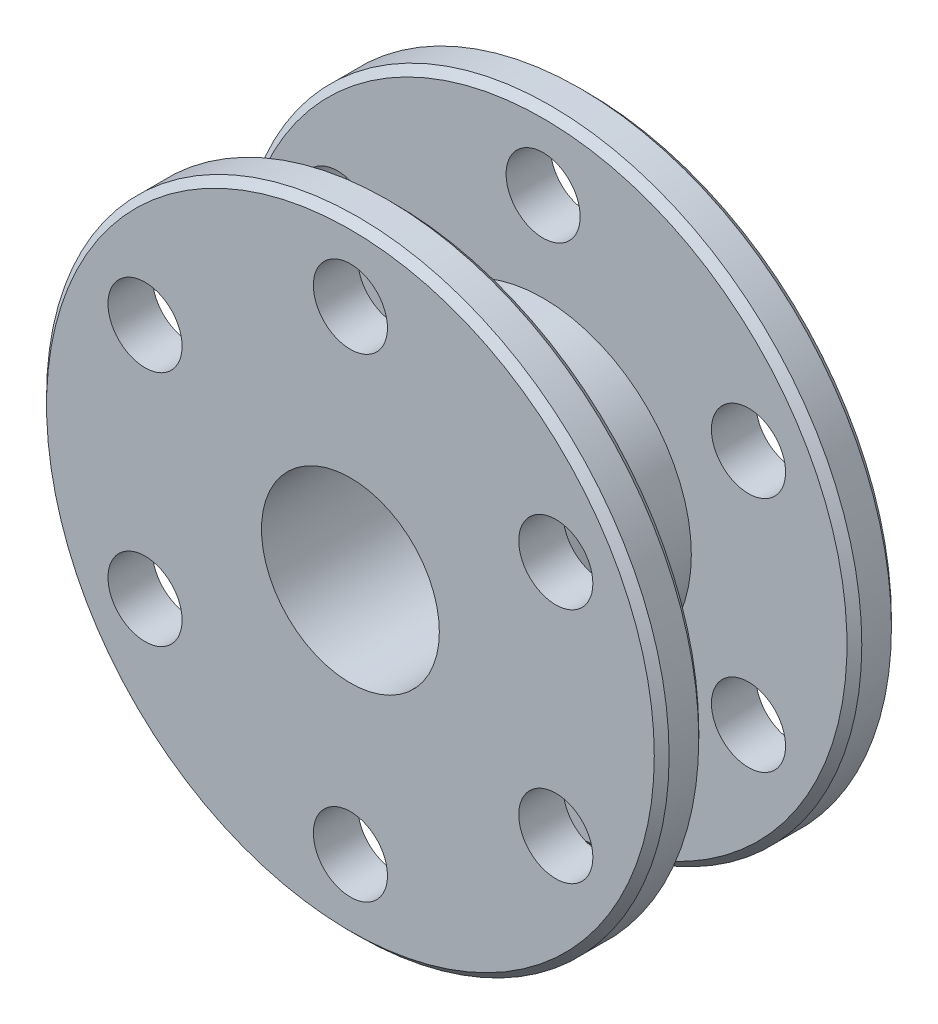
ISO-10303-21;
HEADER;
FILE_DESCRIPTION(('STEP AP214'),'2;1');
FILE_NAME('part.step','',(''),(''),'','','');
FILE_SCHEMA(('AUTOMOTIVE_DESIGN { 1 0 10303 214 1 1 1 1 }'));
ENDSEC;
DATA;
#1=APPLICATION_CONTEXT('core data for automotive mechanical design processes');
#2=APPLICATION_PROTOCOL_DEFINITION('international standard','automotive_design',2000,#1);
#3=PRODUCT_CONTEXT('',#1,'mechanical');
#4=PRODUCT('Part','Part','',(#3));
#5=PRODUCT_RELATED_PRODUCT_CATEGORY('part','',(#4));
#6=PRODUCT_DEFINITION_FORMATION('','',#4);
#7=PRODUCT_DEFINITION_CONTEXT('part definition',#1,'design');
#8=PRODUCT_DEFINITION('design','',#6,#7);
#9=PRODUCT_DEFINITION_SHAPE('','',#8);
#10=(LENGTH_UNIT() NAMED_UNIT(*) SI_UNIT(.MILLI.,.METRE.));
#11=(NAMED_UNIT(*) PLANE_ANGLE_UNIT() SI_UNIT($,.RADIAN.));
#12=(NAMED_UNIT(*) SI_UNIT($,.STERADIAN.) SOLID_ANGLE_UNIT());
#13=UNCERTAINTY_MEASURE_WITH_UNIT(LENGTH_MEASURE(1.E-05),#10,'distance_accuracy_value','');
#14=(GEOMETRIC_REPRESENTATION_CONTEXT(3) GLOBAL_UNCERTAINTY_ASSIGNED_CONTEXT((#13)) GLOBAL_UNIT_ASSIGNED_CONTEXT((#10,
#11,#12)) REPRESENTATION_CONTEXT('',''));
#15=CARTESIAN_POINT('',(0.,0.,0.));
#16=DIRECTION('',(0.,0.,1.));
#17=DIRECTION('',(1.,0.,0.));
#18=AXIS2_PLACEMENT_3D('',#15,#16,#17);
#19=CARTESIAN_POINT('',(0.,0.,16.));
#20=DIRECTION('',(0.,0.,-1.));
#21=DIRECTION('',(-1.,0.,0.));
#22=AXIS2_PLACEMENT_3D('',#19,#20,#21);
#23=CYLINDRICAL_SURFACE('',#22,21.);
#24=CARTESIAN_POINT('',(0.,0.,15.5));
#25=DIRECTION('',(0.,0.,1.));
#26=DIRECTION('',(1.,0.,0.));
#27=AXIS2_PLACEMENT_3D('',#24,#25,#26);
#28=CIRCLE('',#27,21.);
#29=CARTESIAN_POINT('',(21.,0.,15.5));
#30=VERTEX_POINT('',#29);
#31=EDGE_CURVE('E68',#30,#30,#28,.F.);
#32=ORIENTED_EDGE('',*,*,#31,.T.);
#33=EDGE_LOOP('',(#32));
#34=FACE_BOUND('',#33,.T.);
#35=CARTESIAN_POINT('',(0.,0.,13.5));
#36=DIRECTION('',(0.,0.,1.));
#37=DIRECTION('',(1.,0.,0.));
#38=AXIS2_PLACEMENT_3D('',#35,#36,#37);
#39=CIRCLE('',#38,21.);
#40=CARTESIAN_POINT('',(21.,0.,13.5));
#41=VERTEX_POINT('',#40);
#42=EDGE_CURVE('E72',#41,#41,#39,.T.);
#43=ORIENTED_EDGE('',*,*,#42,.T.);
#44=EDGE_LOOP('',(#43));
#45=FACE_BOUND('',#44,.T.);
#46=ADVANCED_FACE('F39',(#34,#45),#23,.T.);
#47=CARTESIAN_POINT('',(0.,16.,16.));
#48=DIRECTION('',(0.,0.,-1.));
#49=DIRECTION('',(-1.,0.,0.));
#50=AXIS2_PLACEMENT_3D('',#47,#48,#49);
#51=CYLINDRICAL_SURFACE('',#50,2.5);
#52=CARTESIAN_POINT('',(0.,16.,13.));
#53=DIRECTION('',(0.,0.,1.));
#54=DIRECTION('',(1.,0.,0.));
#55=AXIS2_PLACEMENT_3D('',#52,#53,#54);
#56=CIRCLE('',#55,2.5);
#57=CARTESIAN_POINT('',(2.5,16.,13.));
#58=VERTEX_POINT('',#57);
#59=EDGE_CURVE('E145',#58,#58,#56,.T.);
#60=ORIENTED_EDGE('',*,*,#59,.F.);
#61=EDGE_LOOP('',(#60));
#62=FACE_BOUND('',#61,.T.);
#63=CARTESIAN_POINT('',(0.,16.,16.));
#64=DIRECTION('',(0.,0.,1.));
#65=DIRECTION('',(1.,0.,0.));
#66=AXIS2_PLACEMENT_3D('',#63,#64,#65);
#67=CIRCLE('',#66,2.5);
#68=CARTESIAN_POINT('',(2.5,16.,16.));
#69=VERTEX_POINT('',#68);
#70=EDGE_CURVE('E97',#69,#69,#67,.T.);
#71=ORIENTED_EDGE('',*,*,#70,.T.);
#72=EDGE_LOOP('',(#71));
#73=FACE_BOUND('',#72,.T.);
#74=ADVANCED_FACE('F219',(#62,#73),#51,.F.);
#75=CARTESIAN_POINT('',(13.856406460551,8.,16.));
#76=DIRECTION('',(0.,0.,-1.));
#77=DIRECTION('',(-1.,0.,0.));
#78=AXIS2_PLACEMENT_3D('',#75,#76,#77);
#79=CYLINDRICAL_SURFACE('',#78,2.5);
#80=CARTESIAN_POINT('',(13.856406460551,8.,13.));
#81=DIRECTION('',(0.,0.,1.));
#82=DIRECTION('',(1.,0.,0.));
#83=AXIS2_PLACEMENT_3D('',#80,#81,#82);
#84=CIRCLE('',#83,2.5);
#85=CARTESIAN_POINT('',(16.356406460551,8.,13.));
#86=VERTEX_POINT('',#85);
#87=EDGE_CURVE('E152',#86,#86,#84,.T.);
#88=ORIENTED_EDGE('',*,*,#87,.F.);
#89=EDGE_LOOP('',(#88));
#90=FACE_BOUND('',#89,.T.);
#91=CARTESIAN_POINT('',(13.856406460551,8.,16.));
#92=DIRECTION('',(0.,0.,1.));
#93=DIRECTION('',(1.,0.,0.));
#94=AXIS2_PLACEMENT_3D('',#91,#92,#93);
#95=CIRCLE('',#94,2.5);
#96=CARTESIAN_POINT('',(16.356406460551,8.,16.));
#97=VERTEX_POINT('',#96);
#98=EDGE_CURVE('E105',#97,#97,#95,.T.);
#99=ORIENTED_EDGE('',*,*,#98,.T.);
#100=EDGE_LOOP('',(#99));
#101=FACE_BOUND('',#100,.T.);
#102=ADVANCED_FACE('F262',(#90,#101),#79,.F.);
#103=CARTESIAN_POINT('',(13.856406460551,-8.,16.));
#104=DIRECTION('',(0.,0.,-1.));
#105=DIRECTION('',(-1.,0.,0.));
#106=AXIS2_PLACEMENT_3D('',#103,#104,#105);
#107=CYLINDRICAL_SURFACE('',#106,2.5);
#108=CARTESIAN_POINT('',(13.856406460551,-8.,13.));
#109=DIRECTION('',(0.,0.,1.));
#110=DIRECTION('',(1.,0.,0.));
#111=AXIS2_PLACEMENT_3D('',#108,#109,#110);
#112=CIRCLE('',#111,2.5);
#113=CARTESIAN_POINT('',(16.356406460551,-8.,13.));
#114=VERTEX_POINT('',#113);
#115=EDGE_CURVE('E156',#114,#114,#112,.T.);
#116=ORIENTED_EDGE('',*,*,#115,.F.);
#117=EDGE_LOOP('',(#116));
#118=FACE_BOUND('',#117,.T.);
#119=CARTESIAN_POINT('',(13.856406460551,-8.,16.));
#120=DIRECTION('',(0.,0.,1.));
#121=DIRECTION('',(1.,0.,0.));
#122=AXIS2_PLACEMENT_3D('',#119,#120,#121);
#123=CIRCLE('',#122,2.5);
#124=CARTESIAN_POINT('',(16.356406460551,-8.,16.));
#125=VERTEX_POINT('',#124);
#126=EDGE_CURVE('E113',#125,#125,#123,.T.);
#127=ORIENTED_EDGE('',*,*,#126,.T.);
#128=EDGE_LOOP('',(#127));
#129=FACE_BOUND('',#128,.T.);
#130=ADVANCED_FACE('F331',(#118,#129),#107,.F.);
#131=CARTESIAN_POINT('',(0.,-16.,16.));
#132=DIRECTION('',(0.,0.,-1.));
#133=DIRECTION('',(-1.,0.,0.));
#134=AXIS2_PLACEMENT_3D('',#131,#132,#133);
#135=CYLINDRICAL_SURFACE('',#134,2.5);
#136=CARTESIAN_POINT('',(0.,-16.,13.));
#137=DIRECTION('',(0.,0.,1.));
#138=DIRECTION('',(1.,0.,0.));
#139=AXIS2_PLACEMENT_3D('',#136,#137,#138);
#140=CIRCLE('',#139,2.5);
#141=CARTESIAN_POINT('',(2.5,-16.,13.));
#142=VERTEX_POINT('',#141);
#143=EDGE_CURVE('E160',#142,#142,#140,.T.);
#144=ORIENTED_EDGE('',*,*,#143,.F.);
#145=EDGE_LOOP('',(#144));
#146=FACE_BOUND('',#145,.T.);
#147=CARTESIAN_POINT('',(0.,-16.,16.));
#148=DIRECTION('',(0.,0.,1.));
#149=DIRECTION('',(1.,0.,0.));
#150=AXIS2_PLACEMENT_3D('',#147,#148,#149);
#151=CIRCLE('',#150,2.5);
#152=CARTESIAN_POINT('',(2.5,-16.,16.));
#153=VERTEX_POINT('',#152);
#154=EDGE_CURVE('E121',#153,#153,#151,.T.);
#155=ORIENTED_EDGE('',*,*,#154,.T.);
#156=EDGE_LOOP('',(#155));
#157=FACE_BOUND('',#156,.T.);
#158=ADVANCED_FACE('F329',(#146,#157),#135,.F.);
#159=CARTESIAN_POINT('',(-13.856406460551,-8.00000000000001,16.));
#160=DIRECTION('',(0.,0.,-1.));
#161=DIRECTION('',(-1.,0.,0.));
#162=AXIS2_PLACEMENT_3D('',#159,#160,#161);
#163=CYLINDRICAL_SURFACE('',#162,2.5);
#164=CARTESIAN_POINT('',(-13.856406460551,-8.00000000000001,13.));
#165=DIRECTION('',(0.,0.,1.));
#166=DIRECTION('',(1.,0.,0.));
#167=AXIS2_PLACEMENT_3D('',#164,#165,#166);
#168=CIRCLE('',#167,2.5);
#169=CARTESIAN_POINT('',(-11.356406460551,-8.00000000000001,13.));
#170=VERTEX_POINT('',#169);
#171=EDGE_CURVE('E85',#170,#170,#168,.T.);
#172=ORIENTED_EDGE('',*,*,#171,.F.);
#173=EDGE_LOOP('',(#172));
#174=FACE_BOUND('',#173,.T.);
#175=CARTESIAN_POINT('',(-13.856406460551,-8.00000000000001,16.));
#176=DIRECTION('',(0.,0.,1.));
#177=DIRECTION('',(1.,0.,0.));
#178=AXIS2_PLACEMENT_3D('',#175,#176,#177);
#179=CIRCLE('',#178,2.5);
#180=CARTESIAN_POINT('',(-11.356406460551,-8.00000000000001,16.));
#181=VERTEX_POINT('',#180);
#182=EDGE_CURVE('E129',#181,#181,#179,.T.);
#183=ORIENTED_EDGE('',*,*,#182,.T.);
#184=EDGE_LOOP('',(#183));
#185=FACE_BOUND('',#184,.T.);
#186=ADVANCED_FACE('F252',(#174,#185),#163,.F.);
#187=CARTESIAN_POINT('',(-13.856406460551,7.99999999999999,16.));
#188=DIRECTION('',(0.,0.,-1.));
#189=DIRECTION('',(-1.,0.,0.));
#190=AXIS2_PLACEMENT_3D('',#187,#188,#189);
#191=CYLINDRICAL_SURFACE('',#190,2.5);
#192=CARTESIAN_POINT('',(-13.856406460551,7.99999999999999,13.));
#193=DIRECTION('',(0.,0.,1.));
#194=DIRECTION('',(1.,0.,0.));
#195=AXIS2_PLACEMENT_3D('',#192,#193,#194);
#196=CIRCLE('',#195,2.5);
#197=CARTESIAN_POINT('',(-11.356406460551,7.99999999999999,13.));
#198=VERTEX_POINT('',#197);
#199=EDGE_CURVE('E81',#198,#198,#196,.T.);
#200=ORIENTED_EDGE('',*,*,#199,.F.);
#201=EDGE_LOOP('',(#200));
#202=FACE_BOUND('',#201,.T.);
#203=CARTESIAN_POINT('',(-13.856406460551,7.99999999999999,16.));
#204=DIRECTION('',(0.,0.,1.));
#205=DIRECTION('',(1.,0.,0.));
#206=AXIS2_PLACEMENT_3D('',#203,#204,#205);
#207=CIRCLE('',#206,2.5);
#208=CARTESIAN_POINT('',(-11.356406460551,7.99999999999999,16.));
#209=VERTEX_POINT('',#208);
#210=EDGE_CURVE('E137',#209,#209,#207,.T.);
#211=ORIENTED_EDGE('',*,*,#210,.T.);
#212=EDGE_LOOP('',(#211));
#213=FACE_BOUND('',#212,.T.);
#214=ADVANCED_FACE('F243',(#202,#213),#191,.F.);
#215=CARTESIAN_POINT('',(0.,0.,16.));
#216=DIRECTION('',(0.,0.,1.));
#217=DIRECTION('',(1.,0.,0.));
#218=AXIS2_PLACEMENT_3D('',#215,#216,#217);
#219=PLANE('',#218);
#220=CARTESIAN_POINT('',(0.,0.,16.));
#221=DIRECTION('',(0.,0.,1.));
#222=DIRECTION('',(1.,0.,0.));
#223=AXIS2_PLACEMENT_3D('',#220,#221,#222);
#224=CIRCLE('',#223,20.5);
#225=CARTESIAN_POINT('',(20.5,0.,16.));
#226=VERTEX_POINT('',#225);
#227=EDGE_CURVE('E76',#226,#226,#224,.T.);
#228=ORIENTED_EDGE('',*,*,#227,.T.);
#229=EDGE_LOOP('',(#228));
#230=FACE_BOUND('',#229,.T.);
#231=ORIENTED_EDGE('',*,*,#182,.F.);
#232=EDGE_LOOP('',(#231));
#233=FACE_BOUND('',#232,.T.);
#234=ORIENTED_EDGE('',*,*,#126,.F.);
#235=EDGE_LOOP('',(#234));
#236=FACE_BOUND('',#235,.T.);
#237=ORIENTED_EDGE('',*,*,#70,.F.);
#238=EDGE_LOOP('',(#237));
#239=FACE_BOUND('',#238,.T.);
#240=CARTESIAN_POINT('',(0.,0.,16.));
#241=DIRECTION('',(0.,0.,1.));
#242=DIRECTION('',(1.,0.,0.));
#243=AXIS2_PLACEMENT_3D('',#240,#241,#242);
#244=CIRCLE('',#243,6.);
#245=CARTESIAN_POINT('',(6.,0.,16.));
#246=VERTEX_POINT('',#245);
#247=EDGE_CURVE('E80',#246,#246,#244,.T.);
#248=ORIENTED_EDGE('',*,*,#247,.F.);
#249=EDGE_LOOP('',(#248));
#250=FACE_BOUND('',#249,.T.);
#251=ORIENTED_EDGE('',*,*,#98,.F.);
#252=EDGE_LOOP('',(#251));
#253=FACE_BOUND('',#252,.T.);
#254=ORIENTED_EDGE('',*,*,#154,.F.);
#255=EDGE_LOOP('',(#254));
#256=FACE_BOUND('',#255,.T.);
#257=ORIENTED_EDGE('',*,*,#210,.F.);
#258=EDGE_LOOP('',(#257));
#259=FACE_BOUND('',#258,.T.);
#260=ADVANCED_FACE('F226',(#230,#233,#236,#239,#250,#253,#256,#259),#219,.T.);
#261=CARTESIAN_POINT('',(0.,0.,0.));
#262=DIRECTION('',(0.,0.,1.));
#263=DIRECTION('',(1.,0.,0.));
#264=AXIS2_PLACEMENT_3D('',#261,#262,#263);
#265=PLANE('',#264);
#266=CARTESIAN_POINT('',(0.,0.,0.));
#267=DIRECTION('',(0.,0.,1.));
#268=DIRECTION('',(1.,0.,0.));
#269=AXIS2_PLACEMENT_3D('',#266,#267,#268);
#270=CIRCLE('',#269,20.5);
#271=CARTESIAN_POINT('',(20.5,0.,0.));
#272=VERTEX_POINT('',#271);
#273=EDGE_CURVE('E10',#272,#272,#270,.F.);
#274=ORIENTED_EDGE('',*,*,#273,.T.);
#275=EDGE_LOOP('',(#274));
#276=FACE_BOUND('',#275,.T.);
#277=CARTESIAN_POINT('',(0.,0.,0.));
#278=DIRECTION('',(0.,0.,1.));
#279=DIRECTION('',(1.,0.,0.));
#280=AXIS2_PLACEMENT_3D('',#277,#278,#279);
#281=CIRCLE('',#280,6.);
#282=CARTESIAN_POINT('',(6.,0.,0.));
#283=VERTEX_POINT('',#282);
#284=EDGE_CURVE('E93',#283,#283,#281,.T.);
#285=ORIENTED_EDGE('',*,*,#284,.T.);
#286=EDGE_LOOP('',(#285));
#287=FACE_BOUND('',#286,.T.);
#288=CARTESIAN_POINT('',(0.,16.,0.));
#289=DIRECTION('',(0.,0.,1.));
#290=DIRECTION('',(1.,0.,0.));
#291=AXIS2_PLACEMENT_3D('',#288,#289,#290);
#292=CIRCLE('',#291,2.5);
#293=CARTESIAN_POINT('',(2.5,16.,0.));
#294=VERTEX_POINT('',#293);
#295=EDGE_CURVE('E101',#294,#294,#292,.T.);
#296=ORIENTED_EDGE('',*,*,#295,.T.);
#297=EDGE_LOOP('',(#296));
#298=FACE_BOUND('',#297,.T.);
#299=CARTESIAN_POINT('',(13.856406460551,8.,0.));
#300=DIRECTION('',(0.,0.,1.));
#301=DIRECTION('',(1.,0.,0.));
#302=AXIS2_PLACEMENT_3D('',#299,#300,#301);
#303=CIRCLE('',#302,2.5);
#304=CARTESIAN_POINT('',(16.356406460551,8.,0.));
#305=VERTEX_POINT('',#304);
#306=EDGE_CURVE('E109',#305,#305,#303,.T.);
#307=ORIENTED_EDGE('',*,*,#306,.T.);
#308=EDGE_LOOP('',(#307));
#309=FACE_BOUND('',#308,.T.);
#310=CARTESIAN_POINT('',(13.856406460551,-8.,0.));
#311=DIRECTION('',(0.,0.,1.));
#312=DIRECTION('',(1.,0.,0.));
#313=AXIS2_PLACEMENT_3D('',#310,#311,#312);
#314=CIRCLE('',#313,2.5);
#315=CARTESIAN_POINT('',(16.356406460551,-8.,0.));
#316=VERTEX_POINT('',#315);
#317=EDGE_CURVE('E117',#316,#316,#314,.T.);
#318=ORIENTED_EDGE('',*,*,#317,.T.);
#319=EDGE_LOOP('',(#318));
#320=FACE_BOUND('',#319,.T.);
#321=CARTESIAN_POINT('',(0.,-16.,0.));
#322=DIRECTION('',(0.,0.,1.));
#323=DIRECTION('',(1.,0.,0.));
#324=AXIS2_PLACEMENT_3D('',#321,#322,#323);
#325=CIRCLE('',#324,2.5);
#326=CARTESIAN_POINT('',(2.5,-16.,0.));
#327=VERTEX_POINT('',#326);
#328=EDGE_CURVE('E125',#327,#327,#325,.T.);
#329=ORIENTED_EDGE('',*,*,#328,.T.);
#330=EDGE_LOOP('',(#329));
#331=FACE_BOUND('',#330,.T.);
#332=CARTESIAN_POINT('',(-13.856406460551,-8.00000000000001,0.));
#333=DIRECTION('',(0.,0.,1.));
#334=DIRECTION('',(1.,0.,0.));
#335=AXIS2_PLACEMENT_3D('',#332,#333,#334);
#336=CIRCLE('',#335,2.5);
#337=CARTESIAN_POINT('',(-11.356406460551,-8.00000000000001,0.));
#338=VERTEX_POINT('',#337);
#339=EDGE_CURVE('E133',#338,#338,#336,.T.);
#340=ORIENTED_EDGE('',*,*,#339,.T.);
#341=EDGE_LOOP('',(#340));
#342=FACE_BOUND('',#341,.T.);
#343=CARTESIAN_POINT('',(-13.856406460551,7.99999999999999,0.));
#344=DIRECTION('',(0.,0.,1.));
#345=DIRECTION('',(1.,0.,0.));
#346=AXIS2_PLACEMENT_3D('',#343,#344,#345);
#347=CIRCLE('',#346,2.5);
#348=CARTESIAN_POINT('',(-11.356406460551,7.99999999999999,0.));
#349=VERTEX_POINT('',#348);
#350=EDGE_CURVE('E141',#349,#349,#347,.T.);
#351=ORIENTED_EDGE('',*,*,#350,.T.);
#352=EDGE_LOOP('',(#351));
#353=FACE_BOUND('',#352,.T.);
#354=ADVANCED_FACE('F222',(#276,#287,#298,#309,#320,#331,#342,#353),#265,.F.);
#355=CARTESIAN_POINT('',(0.,0.,2.49999999999999));
#356=DIRECTION('',(0.,0.,-1.));
#357=DIRECTION('',(-1.,0.,0.));
#358=AXIS2_PLACEMENT_3D('',#355,#356,#357);
#359=CIRCLE('',#358,21.);
#360=CARTESIAN_POINT('',(-21.,0.,2.49999999999999));
#361=VERTEX_POINT('',#360);
#362=EDGE_CURVE('E58',#361,#361,#359,.T.);
#363=ORIENTED_EDGE('',*,*,#362,.T.);
#364=EDGE_LOOP('',(#363));
#365=FACE_BOUND('',#364,.T.);
#366=CARTESIAN_POINT('',(0.,0.,0.499999999999994));
#367=DIRECTION('',(0.,0.,1.));
#368=DIRECTION('',(1.,0.,0.));
#369=AXIS2_PLACEMENT_3D('',#366,#367,#368);
#370=CIRCLE('',#369,21.);
#371=CARTESIAN_POINT('',(21.,0.,0.499999999999994));
#372=VERTEX_POINT('',#371);
#373=EDGE_CURVE('E64',#372,#372,#370,.T.);
#374=ORIENTED_EDGE('',*,*,#373,.T.);
#375=EDGE_LOOP('',(#374));
#376=FACE_BOUND('',#375,.T.);
#377=ADVANCED_FACE('F225',(#365,#376),#23,.T.);
#378=CARTESIAN_POINT('',(0.,0.,16.));
#379=DIRECTION('',(0.,0.,-1.));
#380=DIRECTION('',(-1.,0.,0.));
#381=AXIS2_PLACEMENT_3D('',#378,#379,#380);
#382=CYLINDRICAL_SURFACE('',#381,6.);
#383=ORIENTED_EDGE('',*,*,#247,.T.);
#384=EDGE_LOOP('',(#383));
#385=FACE_BOUND('',#384,.T.);
#386=ORIENTED_EDGE('',*,*,#284,.F.);
#387=EDGE_LOOP('',(#386));
#388=FACE_BOUND('',#387,.T.);
#389=ADVANCED_FACE('F217',(#385,#388),#382,.F.);
#390=CARTESIAN_POINT('',(0.,16.,3.));
#391=DIRECTION('',(0.,0.,-1.));
#392=DIRECTION('',(-1.,0.,0.));
#393=AXIS2_PLACEMENT_3D('',#390,#391,#392);
#394=CIRCLE('',#393,2.5);
#395=CARTESIAN_POINT('',(-2.5,16.,3.));
#396=VERTEX_POINT('',#395);
#397=EDGE_CURVE('E86',#396,#396,#394,.T.);
#398=ORIENTED_EDGE('',*,*,#397,.F.);
#399=EDGE_LOOP('',(#398));
#400=FACE_BOUND('',#399,.T.);
#401=ORIENTED_EDGE('',*,*,#295,.F.);
#402=EDGE_LOOP('',(#401));
#403=FACE_BOUND('',#402,.T.);
#404=ADVANCED_FACE('F213',(#400,#403),#51,.F.);
#405=CARTESIAN_POINT('',(13.856406460551,8.,3.));
#406=DIRECTION('',(0.,0.,-1.));
#407=DIRECTION('',(-1.,0.,0.));
#408=AXIS2_PLACEMENT_3D('',#405,#406,#407);
#409=CIRCLE('',#408,2.5);
#410=CARTESIAN_POINT('',(11.356406460551,8.,3.));
#411=VERTEX_POINT('',#410);
#412=EDGE_CURVE('E170',#411,#411,#409,.T.);
#413=ORIENTED_EDGE('',*,*,#412,.F.);
#414=EDGE_LOOP('',(#413));
#415=FACE_BOUND('',#414,.T.);
#416=ORIENTED_EDGE('',*,*,#306,.F.);
#417=EDGE_LOOP('',(#416));
#418=FACE_BOUND('',#417,.T.);
#419=ADVANCED_FACE('F216',(#415,#418),#79,.F.);
#420=CARTESIAN_POINT('',(13.856406460551,-8.,3.));
#421=DIRECTION('',(0.,0.,-1.));
#422=DIRECTION('',(-1.,0.,0.));
#423=AXIS2_PLACEMENT_3D('',#420,#421,#422);
#424=CIRCLE('',#423,2.5);
#425=CARTESIAN_POINT('',(11.356406460551,-8.,3.));
#426=VERTEX_POINT('',#425);
#427=EDGE_CURVE('E174',#426,#426,#424,.T.);
#428=ORIENTED_EDGE('',*,*,#427,.F.);
#429=EDGE_LOOP('',(#428));
#430=FACE_BOUND('',#429,.T.);
#431=ORIENTED_EDGE('',*,*,#317,.F.);
#432=EDGE_LOOP('',(#431));
#433=FACE_BOUND('',#432,.T.);
#434=ADVANCED_FACE('F341',(#430,#433),#107,.F.);
#435=CARTESIAN_POINT('',(0.,-16.,3.));
#436=DIRECTION('',(0.,0.,-1.));
#437=DIRECTION('',(-1.,0.,0.));
#438=AXIS2_PLACEMENT_3D('',#435,#436,#437);
#439=CIRCLE('',#438,2.5);
#440=CARTESIAN_POINT('',(-2.5,-16.,3.));
#441=VERTEX_POINT('',#440);
#442=EDGE_CURVE('E178',#441,#441,#439,.T.);
#443=ORIENTED_EDGE('',*,*,#442,.F.);
#444=EDGE_LOOP('',(#443));
#445=FACE_BOUND('',#444,.T.);
#446=ORIENTED_EDGE('',*,*,#328,.F.);
#447=EDGE_LOOP('',(#446));
#448=FACE_BOUND('',#447,.T.);
#449=ADVANCED_FACE('F249',(#445,#448),#135,.F.);
#450=CARTESIAN_POINT('',(-13.856406460551,-8.00000000000001,3.));
#451=DIRECTION('',(0.,0.,-1.));
#452=DIRECTION('',(-1.,0.,0.));
#453=AXIS2_PLACEMENT_3D('',#450,#451,#452);
#454=CIRCLE('',#453,2.5);
#455=CARTESIAN_POINT('',(-16.356406460551,-8.00000000000001,3.));
#456=VERTEX_POINT('',#455);
#457=EDGE_CURVE('E91',#456,#456,#454,.T.);
#458=ORIENTED_EDGE('',*,*,#457,.F.);
#459=EDGE_LOOP('',(#458));
#460=FACE_BOUND('',#459,.T.);
#461=ORIENTED_EDGE('',*,*,#339,.F.);
#462=EDGE_LOOP('',(#461));
#463=FACE_BOUND('',#462,.T.);
#464=ADVANCED_FACE('F240',(#460,#463),#163,.F.);
#465=CARTESIAN_POINT('',(-13.856406460551,7.99999999999999,3.));
#466=DIRECTION('',(0.,0.,-1.));
#467=DIRECTION('',(-1.,0.,0.));
#468=AXIS2_PLACEMENT_3D('',#465,#466,#467);
#469=CIRCLE('',#468,2.5);
#470=CARTESIAN_POINT('',(-16.356406460551,7.99999999999999,3.));
#471=VERTEX_POINT('',#470);
#472=EDGE_CURVE('E87',#471,#471,#469,.T.);
#473=ORIENTED_EDGE('',*,*,#472,.F.);
#474=EDGE_LOOP('',(#473));
#475=FACE_BOUND('',#474,.T.);
#476=ORIENTED_EDGE('',*,*,#350,.F.);
#477=EDGE_LOOP('',(#476));
#478=FACE_BOUND('',#477,.T.);
#479=ADVANCED_FACE('F238',(#475,#478),#191,.F.);
#480=CARTESIAN_POINT('',(10.,0.,13.));
#481=DIRECTION('',(0.,0.,1.));
#482=DIRECTION('',(1.,0.,0.));
#483=AXIS2_PLACEMENT_3D('',#480,#481,#482);
#484=PLANE('',#483);
#485=CARTESIAN_POINT('',(0.,0.,13.));
#486=DIRECTION('',(0.,0.,1.));
#487=DIRECTION('',(1.,0.,0.));
#488=AXIS2_PLACEMENT_3D('',#485,#486,#487);
#489=CIRCLE('',#488,20.5);
#490=CARTESIAN_POINT('',(20.5,0.,13.));
#491=VERTEX_POINT('',#490);
#492=EDGE_CURVE('E48',#491,#491,#489,.F.);
#493=ORIENTED_EDGE('',*,*,#492,.T.);
#494=EDGE_LOOP('',(#493));
#495=FACE_BOUND('',#494,.T.);
#496=CARTESIAN_POINT('',(0.,0.,13.));
#497=DIRECTION('',(0.,0.,1.));
#498=DIRECTION('',(1.,0.,0.));
#499=AXIS2_PLACEMENT_3D('',#496,#497,#498);
#500=CIRCLE('',#499,10.);
#501=CARTESIAN_POINT('',(10.,0.,13.));
#502=VERTEX_POINT('',#501);
#503=EDGE_CURVE('E92',#502,#502,#500,.T.);
#504=ORIENTED_EDGE('',*,*,#503,.T.);
#505=EDGE_LOOP('',(#504));
#506=FACE_BOUND('',#505,.T.);
#507=ORIENTED_EDGE('',*,*,#199,.T.);
#508=EDGE_LOOP('',(#507));
#509=FACE_BOUND('',#508,.T.);
#510=ORIENTED_EDGE('',*,*,#171,.T.);
#511=EDGE_LOOP('',(#510));
#512=FACE_BOUND('',#511,.T.);
#513=ORIENTED_EDGE('',*,*,#143,.T.);
#514=EDGE_LOOP('',(#513));
#515=FACE_BOUND('',#514,.T.);
#516=ORIENTED_EDGE('',*,*,#115,.T.);
#517=EDGE_LOOP('',(#516));
#518=FACE_BOUND('',#517,.T.);
#519=ORIENTED_EDGE('',*,*,#87,.T.);
#520=EDGE_LOOP('',(#519));
#521=FACE_BOUND('',#520,.T.);
#522=ORIENTED_EDGE('',*,*,#59,.T.);
#523=EDGE_LOOP('',(#522));
#524=FACE_BOUND('',#523,.T.);
#525=ADVANCED_FACE('F198',(#495,#506,#509,#512,#515,#518,#521,#524),#484,.F.);
#526=CARTESIAN_POINT('',(10.,0.,3.));
#527=DIRECTION('',(0.,0.,-1.));
#528=DIRECTION('',(-1.,0.,0.));
#529=AXIS2_PLACEMENT_3D('',#526,#527,#528);
#530=PLANE('',#529);
#531=CARTESIAN_POINT('',(0.,0.,3.));
#532=DIRECTION('',(0.,0.,-1.));
#533=DIRECTION('',(-1.,0.,0.));
#534=AXIS2_PLACEMENT_3D('',#531,#532,#533);
#535=CIRCLE('',#534,20.5);
#536=CARTESIAN_POINT('',(-20.5,0.,3.));
#537=VERTEX_POINT('',#536);
#538=EDGE_CURVE('E53',#537,#537,#535,.F.);
#539=ORIENTED_EDGE('',*,*,#538,.T.);
#540=EDGE_LOOP('',(#539));
#541=FACE_BOUND('',#540,.T.);
#542=CARTESIAN_POINT('',(0.,0.,3.));
#543=DIRECTION('',(0.,0.,1.));
#544=DIRECTION('',(1.,0.,0.));
#545=AXIS2_PLACEMENT_3D('',#542,#543,#544);
#546=CIRCLE('',#545,10.);
#547=CARTESIAN_POINT('',(10.,0.,3.));
#548=VERTEX_POINT('',#547);
#549=EDGE_CURVE('E188',#548,#548,#546,.T.);
#550=ORIENTED_EDGE('',*,*,#549,.F.);
#551=EDGE_LOOP('',(#550));
#552=FACE_BOUND('',#551,.T.);
#553=ORIENTED_EDGE('',*,*,#472,.T.);
#554=EDGE_LOOP('',(#553));
#555=FACE_BOUND('',#554,.T.);
#556=ORIENTED_EDGE('',*,*,#457,.T.);
#557=EDGE_LOOP('',(#556));
#558=FACE_BOUND('',#557,.T.);
#559=ORIENTED_EDGE('',*,*,#442,.T.);
#560=EDGE_LOOP('',(#559));
#561=FACE_BOUND('',#560,.T.);
#562=ORIENTED_EDGE('',*,*,#427,.T.);
#563=EDGE_LOOP('',(#562));
#564=FACE_BOUND('',#563,.T.);
#565=ORIENTED_EDGE('',*,*,#412,.T.);
#566=EDGE_LOOP('',(#565));
#567=FACE_BOUND('',#566,.T.);
#568=ORIENTED_EDGE('',*,*,#397,.T.);
#569=EDGE_LOOP('',(#568));
#570=FACE_BOUND('',#569,.T.);
#571=ADVANCED_FACE('F195',(#541,#552,#555,#558,#561,#564,#567,#570),#530,.F.);
#572=CARTESIAN_POINT('',(0.,0.,16.));
#573=DIRECTION('',(0.,0.,1.));
#574=DIRECTION('',(1.,0.,0.));
#575=AXIS2_PLACEMENT_3D('',#572,#573,#574);
#576=CYLINDRICAL_SURFACE('',#575,10.);
#577=ORIENTED_EDGE('',*,*,#503,.F.);
#578=EDGE_LOOP('',(#577));
#579=FACE_BOUND('',#578,.T.);
#580=ORIENTED_EDGE('',*,*,#549,.T.);
#581=EDGE_LOOP('',(#580));
#582=FACE_BOUND('',#581,.T.);
#583=ADVANCED_FACE('F193',(#579,#582),#576,.T.);
#584=CARTESIAN_POINT('',(0.,0.,16.));
#585=DIRECTION('',(0.,0.,-1.));
#586=DIRECTION('',(-1.,0.,0.));
#587=AXIS2_PLACEMENT_3D('',#584,#585,#586);
#588=CONICAL_SURFACE('',#587,20.5,0.785398163397448);
#589=ORIENTED_EDGE('',*,*,#31,.F.);
#590=EDGE_LOOP('',(#589));
#591=FACE_BOUND('',#590,.T.);
#592=ORIENTED_EDGE('',*,*,#227,.F.);
#593=EDGE_LOOP('',(#592));
#594=FACE_BOUND('',#593,.T.);
#595=ADVANCED_FACE('F288',(#591,#594),#588,.T.);
#596=CARTESIAN_POINT('',(0.,0.,2.49999999999999));
#597=DIRECTION('',(0.,0.,-1.));
#598=DIRECTION('',(-1.,0.,0.));
#599=AXIS2_PLACEMENT_3D('',#596,#597,#598);
#600=CONICAL_SURFACE('',#599,21.,0.785398163397448);
#601=ORIENTED_EDGE('',*,*,#538,.F.);
#602=EDGE_LOOP('',(#601));
#603=FACE_BOUND('',#602,.T.);
#604=ORIENTED_EDGE('',*,*,#362,.F.);
#605=EDGE_LOOP('',(#604));
#606=FACE_BOUND('',#605,.T.);
#607=ADVANCED_FACE('F283',(#603,#606),#600,.T.);
#608=CARTESIAN_POINT('',(0.,0.,13.5));
#609=DIRECTION('',(0.,0.,1.));
#610=DIRECTION('',(1.,0.,0.));
#611=AXIS2_PLACEMENT_3D('',#608,#609,#610);
#612=CONICAL_SURFACE('',#611,21.,0.785398163397448);
#613=ORIENTED_EDGE('',*,*,#492,.F.);
#614=EDGE_LOOP('',(#613));
#615=FACE_BOUND('',#614,.T.);
#616=ORIENTED_EDGE('',*,*,#42,.F.);
#617=EDGE_LOOP('',(#616));
#618=FACE_BOUND('',#617,.T.);
#619=ADVANCED_FACE('F278',(#615,#618),#612,.T.);
#620=CARTESIAN_POINT('',(0.,0.,0.499999999999994));
#621=DIRECTION('',(0.,0.,1.));
#622=DIRECTION('',(1.,0.,0.));
#623=AXIS2_PLACEMENT_3D('',#620,#621,#622);
#624=CONICAL_SURFACE('',#623,21.,0.785398163397448);
#625=ORIENTED_EDGE('',*,*,#273,.F.);
#626=EDGE_LOOP('',(#625));
#627=FACE_BOUND('',#626,.T.);
#628=ORIENTED_EDGE('',*,*,#373,.F.);
#629=EDGE_LOOP('',(#628));
#630=FACE_BOUND('',#629,.T.);
#631=ADVANCED_FACE('F42',(#627,#630),#624,.T.);
#632=CLOSED_SHELL('',(#46,#74,#102,#130,#158,#186,#214,#260,#354,#377,#389,#404,#419,#434,#449,
#464,#479,#525,#571,#583,#595,#607,#619,#631));
#633=MANIFOLD_SOLID_BREP('B2',#632);
#634=ADVANCED_BREP_SHAPE_REPRESENTATION('',(#18,#633),#14);
#635=SHAPE_DEFINITION_REPRESENTATION(#9,#634);
ENDSEC;
END-ISO-10303-21;
